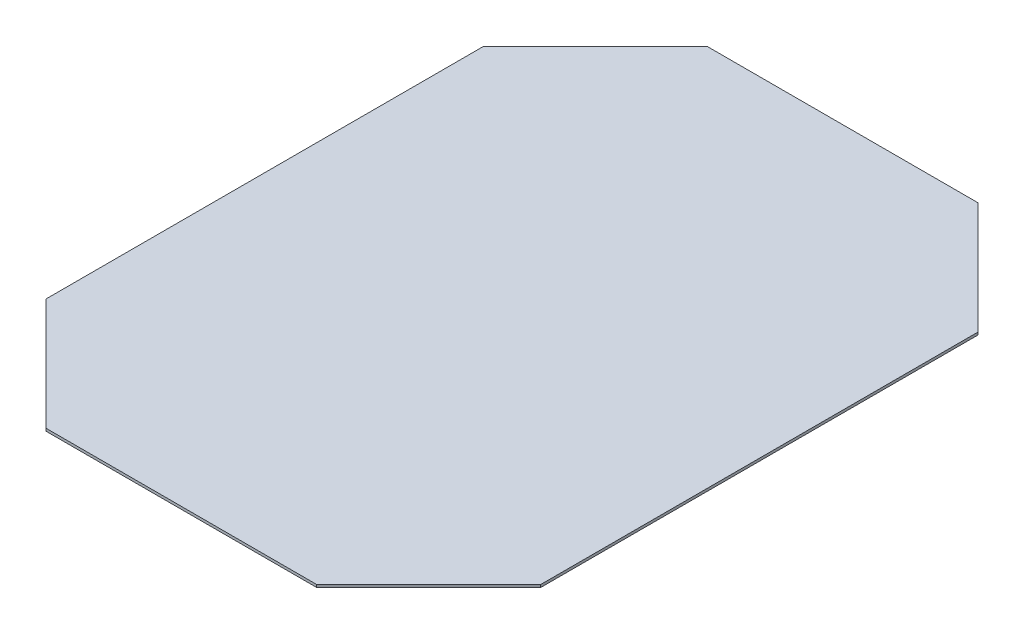
ISO-10303-21;
HEADER;
FILE_DESCRIPTION(('STEP AP214'),'2;1');
FILE_NAME('part.step','',(''),(''),'','','');
FILE_SCHEMA(('AUTOMOTIVE_DESIGN { 1 0 10303 214 1 1 1 1 }'));
ENDSEC;
DATA;
#1=APPLICATION_CONTEXT('core data for automotive mechanical design processes');
#2=APPLICATION_PROTOCOL_DEFINITION('international standard','automotive_design',2000,#1);
#3=PRODUCT_CONTEXT('',#1,'mechanical');
#4=PRODUCT('Part','Part','',(#3));
#5=PRODUCT_RELATED_PRODUCT_CATEGORY('part','',(#4));
#6=PRODUCT_DEFINITION_FORMATION('','',#4);
#7=PRODUCT_DEFINITION_CONTEXT('part definition',#1,'design');
#8=PRODUCT_DEFINITION('design','',#6,#7);
#9=PRODUCT_DEFINITION_SHAPE('','',#8);
#10=(LENGTH_UNIT() NAMED_UNIT(*) SI_UNIT(.MILLI.,.METRE.));
#11=(NAMED_UNIT(*) PLANE_ANGLE_UNIT() SI_UNIT($,.RADIAN.));
#12=(NAMED_UNIT(*) SI_UNIT($,.STERADIAN.) SOLID_ANGLE_UNIT());
#13=UNCERTAINTY_MEASURE_WITH_UNIT(LENGTH_MEASURE(1.E-05),#10,'distance_accuracy_value','');
#14=(GEOMETRIC_REPRESENTATION_CONTEXT(3) GLOBAL_UNCERTAINTY_ASSIGNED_CONTEXT((#13)) GLOBAL_UNIT_ASSIGNED_CONTEXT((#10,
#11,#12)) REPRESENTATION_CONTEXT('',''));
#15=CARTESIAN_POINT('',(0.,0.,0.));
#16=DIRECTION('',(0.,0.,1.));
#17=DIRECTION('',(1.,0.,0.));
#18=AXIS2_PLACEMENT_3D('',#15,#16,#17);
#19=CARTESIAN_POINT('',(-150.8125,1.5875,-133.35));
#20=DIRECTION('',(0.707106781186546,0.,0.707106781186549));
#21=DIRECTION('',(0.707106781186549,0.,-0.707106781186546));
#22=AXIS2_PLACEMENT_3D('',#19,#20,#21);
#23=PLANE('',#22);
#24=DIRECTION('',(-0.707106781186549,0.,0.707106781186546));
#25=VECTOR('',#24,1.);
#26=CARTESIAN_POINT('',(-150.8125,0.,-133.35));
#27=LINE('',#26,#25);
#28=CARTESIAN_POINT('',(-82.55,0.,-201.6125));
#29=VERTEX_POINT('',#28);
#30=CARTESIAN_POINT('',(-150.8125,0.,-133.35));
#31=VERTEX_POINT('',#30);
#32=EDGE_CURVE('E131',#29,#31,#27,.T.);
#33=ORIENTED_EDGE('',*,*,#32,.T.);
#34=DIRECTION('',(0.,-1.,0.));
#35=VECTOR('',#34,1.);
#36=CARTESIAN_POINT('',(-150.8125,1.5875,-133.35));
#37=LINE('',#36,#35);
#38=CARTESIAN_POINT('',(-150.8125,1.5875,-133.35));
#39=VERTEX_POINT('',#38);
#40=EDGE_CURVE('E11',#39,#31,#37,.T.);
#41=ORIENTED_EDGE('',*,*,#40,.F.);
#42=DIRECTION('',(-0.707106781186549,0.,0.707106781186546));
#43=VECTOR('',#42,1.);
#44=CARTESIAN_POINT('',(-150.8125,1.5875,-133.35));
#45=LINE('',#44,#43);
#46=CARTESIAN_POINT('',(-82.55,1.5875,-201.6125));
#47=VERTEX_POINT('',#46);
#48=EDGE_CURVE('E145',#47,#39,#45,.T.);
#49=ORIENTED_EDGE('',*,*,#48,.F.);
#50=DIRECTION('',(0.,-1.,0.));
#51=VECTOR('',#50,1.);
#52=CARTESIAN_POINT('',(-82.55,1.5875,-201.6125));
#53=LINE('',#52,#51);
#54=EDGE_CURVE('E127',#47,#29,#53,.T.);
#55=ORIENTED_EDGE('',*,*,#54,.T.);
#56=EDGE_LOOP('',(#33,#41,#49,#55));
#57=FACE_BOUND('',#56,.T.);
#58=ADVANCED_FACE('F35',(#57),#23,.F.);
#59=CARTESIAN_POINT('',(-150.8125,1.5875,133.35));
#60=DIRECTION('',(1.,0.,0.));
#61=DIRECTION('',(0.,0.,-1.));
#62=AXIS2_PLACEMENT_3D('',#59,#60,#61);
#63=PLANE('',#62);
#64=DIRECTION('',(0.,0.,1.));
#65=VECTOR('',#64,1.);
#66=CARTESIAN_POINT('',(-150.8125,0.,133.35));
#67=LINE('',#66,#65);
#68=CARTESIAN_POINT('',(-150.8125,0.,133.35));
#69=VERTEX_POINT('',#68);
#70=EDGE_CURVE('E134',#31,#69,#67,.T.);
#71=ORIENTED_EDGE('',*,*,#70,.T.);
#72=DIRECTION('',(0.,-1.,0.));
#73=VECTOR('',#72,1.);
#74=CARTESIAN_POINT('',(-150.8125,1.5875,133.35));
#75=LINE('',#74,#73);
#76=CARTESIAN_POINT('',(-150.8125,1.5875,133.35));
#77=VERTEX_POINT('',#76);
#78=EDGE_CURVE('E43',#77,#69,#75,.T.);
#79=ORIENTED_EDGE('',*,*,#78,.F.);
#80=DIRECTION('',(0.,0.,1.));
#81=VECTOR('',#80,1.);
#82=CARTESIAN_POINT('',(-150.8125,1.5875,133.35));
#83=LINE('',#82,#81);
#84=EDGE_CURVE('E94',#39,#77,#83,.T.);
#85=ORIENTED_EDGE('',*,*,#84,.F.);
#86=ORIENTED_EDGE('',*,*,#40,.T.);
#87=EDGE_LOOP('',(#71,#79,#85,#86));
#88=FACE_BOUND('',#87,.T.);
#89=ADVANCED_FACE('F180',(#88),#63,.F.);
#90=CARTESIAN_POINT('',(-82.55,1.5875,201.6125));
#91=DIRECTION('',(0.707106781186547,0.,-0.707106781186548));
#92=DIRECTION('',(-0.707106781186548,0.,-0.707106781186547));
#93=AXIS2_PLACEMENT_3D('',#90,#91,#92);
#94=PLANE('',#93);
#95=DIRECTION('',(0.707106781186548,0.,0.707106781186547));
#96=VECTOR('',#95,1.);
#97=CARTESIAN_POINT('',(-82.55,0.,201.6125));
#98=LINE('',#97,#96);
#99=CARTESIAN_POINT('',(-82.55,0.,201.6125));
#100=VERTEX_POINT('',#99);
#101=EDGE_CURVE('E136',#69,#100,#98,.T.);
#102=ORIENTED_EDGE('',*,*,#101,.T.);
#103=DIRECTION('',(0.,-1.,0.));
#104=VECTOR('',#103,1.);
#105=CARTESIAN_POINT('',(-82.55,1.5875,201.6125));
#106=LINE('',#105,#104);
#107=CARTESIAN_POINT('',(-82.55,1.5875,201.6125));
#108=VERTEX_POINT('',#107);
#109=EDGE_CURVE('E152',#108,#100,#106,.T.);
#110=ORIENTED_EDGE('',*,*,#109,.F.);
#111=DIRECTION('',(0.707106781186548,0.,0.707106781186547));
#112=VECTOR('',#111,1.);
#113=CARTESIAN_POINT('',(-82.55,1.5875,201.6125));
#114=LINE('',#113,#112);
#115=EDGE_CURVE('E160',#77,#108,#114,.T.);
#116=ORIENTED_EDGE('',*,*,#115,.F.);
#117=ORIENTED_EDGE('',*,*,#78,.T.);
#118=EDGE_LOOP('',(#102,#110,#116,#117));
#119=FACE_BOUND('',#118,.T.);
#120=ADVANCED_FACE('F158',(#119),#94,.F.);
#121=CARTESIAN_POINT('',(82.55,1.5875,201.6125));
#122=DIRECTION('',(0.,0.,-1.));
#123=DIRECTION('',(-1.,0.,0.));
#124=AXIS2_PLACEMENT_3D('',#121,#122,#123);
#125=PLANE('',#124);
#126=DIRECTION('',(1.,0.,0.));
#127=VECTOR('',#126,1.);
#128=CARTESIAN_POINT('',(82.55,0.,201.6125));
#129=LINE('',#128,#127);
#130=CARTESIAN_POINT('',(82.55,0.,201.6125));
#131=VERTEX_POINT('',#130);
#132=EDGE_CURVE('E138',#100,#131,#129,.T.);
#133=ORIENTED_EDGE('',*,*,#132,.T.);
#134=DIRECTION('',(0.,-1.,0.));
#135=VECTOR('',#134,1.);
#136=CARTESIAN_POINT('',(82.55,1.5875,201.6125));
#137=LINE('',#136,#135);
#138=CARTESIAN_POINT('',(82.55,1.5875,201.6125));
#139=VERTEX_POINT('',#138);
#140=EDGE_CURVE('E149',#139,#131,#137,.T.);
#141=ORIENTED_EDGE('',*,*,#140,.F.);
#142=DIRECTION('',(1.,0.,0.));
#143=VECTOR('',#142,1.);
#144=CARTESIAN_POINT('',(82.55,1.5875,201.6125));
#145=LINE('',#144,#143);
#146=EDGE_CURVE('E172',#108,#139,#145,.T.);
#147=ORIENTED_EDGE('',*,*,#146,.F.);
#148=ORIENTED_EDGE('',*,*,#109,.T.);
#149=EDGE_LOOP('',(#133,#141,#147,#148));
#150=FACE_BOUND('',#149,.T.);
#151=ADVANCED_FACE('F168',(#150),#125,.F.);
#152=CARTESIAN_POINT('',(150.8125,1.5875,133.35));
#153=DIRECTION('',(-0.707106781186547,0.,-0.707106781186549));
#154=DIRECTION('',(-0.707106781186549,0.,0.707106781186547));
#155=AXIS2_PLACEMENT_3D('',#152,#153,#154);
#156=PLANE('',#155);
#157=DIRECTION('',(0.707106781186549,0.,-0.707106781186547));
#158=VECTOR('',#157,1.);
#159=CARTESIAN_POINT('',(150.8125,0.,133.35));
#160=LINE('',#159,#158);
#161=CARTESIAN_POINT('',(150.8125,0.,133.35));
#162=VERTEX_POINT('',#161);
#163=EDGE_CURVE('E140',#131,#162,#160,.T.);
#164=ORIENTED_EDGE('',*,*,#163,.T.);
#165=DIRECTION('',(0.,-1.,0.));
#166=VECTOR('',#165,1.);
#167=CARTESIAN_POINT('',(150.8125,1.5875,133.35));
#168=LINE('',#167,#166);
#169=CARTESIAN_POINT('',(150.8125,1.5875,133.35));
#170=VERTEX_POINT('',#169);
#171=EDGE_CURVE('E122',#170,#162,#168,.T.);
#172=ORIENTED_EDGE('',*,*,#171,.F.);
#173=DIRECTION('',(0.707106781186549,0.,-0.707106781186547));
#174=VECTOR('',#173,1.);
#175=CARTESIAN_POINT('',(150.8125,1.5875,133.35));
#176=LINE('',#175,#174);
#177=EDGE_CURVE('E113',#139,#170,#176,.T.);
#178=ORIENTED_EDGE('',*,*,#177,.F.);
#179=ORIENTED_EDGE('',*,*,#140,.T.);
#180=EDGE_LOOP('',(#164,#172,#178,#179));
#181=FACE_BOUND('',#180,.T.);
#182=ADVANCED_FACE('F171',(#181),#156,.F.);
#183=CARTESIAN_POINT('',(150.8125,1.5875,-133.35));
#184=DIRECTION('',(-1.,0.,0.));
#185=DIRECTION('',(0.,0.,1.));
#186=AXIS2_PLACEMENT_3D('',#183,#184,#185);
#187=PLANE('',#186);
#188=DIRECTION('',(0.,0.,-1.));
#189=VECTOR('',#188,1.);
#190=CARTESIAN_POINT('',(150.8125,0.,-133.35));
#191=LINE('',#190,#189);
#192=CARTESIAN_POINT('',(150.8125,0.,-133.35));
#193=VERTEX_POINT('',#192);
#194=EDGE_CURVE('E121',#162,#193,#191,.T.);
#195=ORIENTED_EDGE('',*,*,#194,.T.);
#196=DIRECTION('',(0.,-1.,0.));
#197=VECTOR('',#196,1.);
#198=CARTESIAN_POINT('',(150.8125,1.5875,-133.35));
#199=LINE('',#198,#197);
#200=CARTESIAN_POINT('',(150.8125,1.5875,-133.35));
#201=VERTEX_POINT('',#200);
#202=EDGE_CURVE('E118',#201,#193,#199,.T.);
#203=ORIENTED_EDGE('',*,*,#202,.F.);
#204=DIRECTION('',(0.,0.,-1.));
#205=VECTOR('',#204,1.);
#206=CARTESIAN_POINT('',(150.8125,1.5875,-133.35));
#207=LINE('',#206,#205);
#208=EDGE_CURVE('E107',#170,#201,#207,.T.);
#209=ORIENTED_EDGE('',*,*,#208,.F.);
#210=ORIENTED_EDGE('',*,*,#171,.T.);
#211=EDGE_LOOP('',(#195,#203,#209,#210));
#212=FACE_BOUND('',#211,.T.);
#213=ADVANCED_FACE('F119',(#212),#187,.F.);
#214=CARTESIAN_POINT('',(82.55,1.5875,-201.6125));
#215=DIRECTION('',(-0.707106781186548,0.,0.707106781186547));
#216=DIRECTION('',(0.707106781186547,0.,0.707106781186548));
#217=AXIS2_PLACEMENT_3D('',#214,#215,#216);
#218=PLANE('',#217);
#219=DIRECTION('',(-0.707106781186547,0.,-0.707106781186548));
#220=VECTOR('',#219,1.);
#221=CARTESIAN_POINT('',(82.55,0.,-201.6125));
#222=LINE('',#221,#220);
#223=CARTESIAN_POINT('',(82.55,0.,-201.6125));
#224=VERTEX_POINT('',#223);
#225=EDGE_CURVE('E80',#193,#224,#222,.T.);
#226=ORIENTED_EDGE('',*,*,#225,.T.);
#227=DIRECTION('',(0.,-1.,0.));
#228=VECTOR('',#227,1.);
#229=CARTESIAN_POINT('',(82.55,1.5875,-201.6125));
#230=LINE('',#229,#228);
#231=CARTESIAN_POINT('',(82.55,1.5875,-201.6125));
#232=VERTEX_POINT('',#231);
#233=EDGE_CURVE('E123',#232,#224,#230,.T.);
#234=ORIENTED_EDGE('',*,*,#233,.F.);
#235=DIRECTION('',(-0.707106781186547,0.,-0.707106781186548));
#236=VECTOR('',#235,1.);
#237=CARTESIAN_POINT('',(82.55,1.5875,-201.6125));
#238=LINE('',#237,#236);
#239=EDGE_CURVE('E111',#201,#232,#238,.T.);
#240=ORIENTED_EDGE('',*,*,#239,.F.);
#241=ORIENTED_EDGE('',*,*,#202,.T.);
#242=EDGE_LOOP('',(#226,#234,#240,#241));
#243=FACE_BOUND('',#242,.T.);
#244=ADVANCED_FACE('F125',(#243),#218,.F.);
#245=CARTESIAN_POINT('',(-82.55,1.5875,-201.6125));
#246=DIRECTION('',(0.,0.,1.));
#247=DIRECTION('',(1.,0.,0.));
#248=AXIS2_PLACEMENT_3D('',#245,#246,#247);
#249=PLANE('',#248);
#250=DIRECTION('',(-1.,0.,0.));
#251=VECTOR('',#250,1.);
#252=CARTESIAN_POINT('',(-82.55,0.,-201.6125));
#253=LINE('',#252,#251);
#254=EDGE_CURVE('E86',#224,#29,#253,.T.);
#255=ORIENTED_EDGE('',*,*,#254,.T.);
#256=ORIENTED_EDGE('',*,*,#54,.F.);
#257=DIRECTION('',(-1.,0.,0.));
#258=VECTOR('',#257,1.);
#259=CARTESIAN_POINT('',(-82.55,1.5875,-201.6125));
#260=LINE('',#259,#258);
#261=EDGE_CURVE('E51',#232,#47,#260,.T.);
#262=ORIENTED_EDGE('',*,*,#261,.F.);
#263=ORIENTED_EDGE('',*,*,#233,.T.);
#264=EDGE_LOOP('',(#255,#256,#262,#263));
#265=FACE_BOUND('',#264,.T.);
#266=ADVANCED_FACE('F196',(#265),#249,.F.);
#267=CARTESIAN_POINT('',(0.,1.5875,0.));
#268=DIRECTION('',(0.,-1.,0.));
#269=DIRECTION('',(0.,0.,-1.));
#270=AXIS2_PLACEMENT_3D('',#267,#268,#269);
#271=PLANE('',#270);
#272=ORIENTED_EDGE('',*,*,#48,.T.);
#273=ORIENTED_EDGE('',*,*,#84,.T.);
#274=ORIENTED_EDGE('',*,*,#115,.T.);
#275=ORIENTED_EDGE('',*,*,#146,.T.);
#276=ORIENTED_EDGE('',*,*,#177,.T.);
#277=ORIENTED_EDGE('',*,*,#208,.T.);
#278=ORIENTED_EDGE('',*,*,#239,.T.);
#279=ORIENTED_EDGE('',*,*,#261,.T.);
#280=EDGE_LOOP('',(#272,#273,#274,#275,#276,#277,#278,#279));
#281=FACE_BOUND('',#280,.T.);
#282=ADVANCED_FACE('F109',(#281),#271,.F.);
#283=CARTESIAN_POINT('',(0.,0.,0.));
#284=DIRECTION('',(0.,-1.,0.));
#285=DIRECTION('',(0.,0.,-1.));
#286=AXIS2_PLACEMENT_3D('',#283,#284,#285);
#287=PLANE('',#286);
#288=ORIENTED_EDGE('',*,*,#32,.F.);
#289=ORIENTED_EDGE('',*,*,#254,.F.);
#290=ORIENTED_EDGE('',*,*,#225,.F.);
#291=ORIENTED_EDGE('',*,*,#194,.F.);
#292=ORIENTED_EDGE('',*,*,#163,.F.);
#293=ORIENTED_EDGE('',*,*,#132,.F.);
#294=ORIENTED_EDGE('',*,*,#101,.F.);
#295=ORIENTED_EDGE('',*,*,#70,.F.);
#296=EDGE_LOOP('',(#288,#289,#290,#291,#292,#293,#294,#295));
#297=FACE_BOUND('',#296,.T.);
#298=ADVANCED_FACE('F164',(#297),#287,.T.);
#299=CLOSED_SHELL('',(#58,#89,#120,#151,#182,#213,#244,#266,#282,#298));
#300=MANIFOLD_SOLID_BREP('B2',#299);
#301=ADVANCED_BREP_SHAPE_REPRESENTATION('',(#18,#300),#14);
#302=SHAPE_DEFINITION_REPRESENTATION(#9,#301);
ENDSEC;
END-ISO-10303-21;
